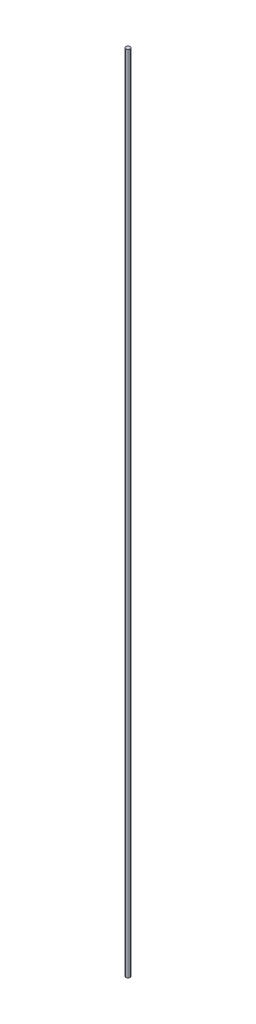
ISO-10303-21;
HEADER;
FILE_DESCRIPTION(('STEP AP214'),'2;1');
FILE_NAME('part.step','',(''),(''),'','','');
FILE_SCHEMA(('AUTOMOTIVE_DESIGN { 1 0 10303 214 1 1 1 1 }'));
ENDSEC;
DATA;
#1=APPLICATION_CONTEXT('core data for automotive mechanical design processes');
#2=APPLICATION_PROTOCOL_DEFINITION('international standard','automotive_design',2000,#1);
#3=PRODUCT_CONTEXT('',#1,'mechanical');
#4=PRODUCT('Part','Part','',(#3));
#5=PRODUCT_RELATED_PRODUCT_CATEGORY('part','',(#4));
#6=PRODUCT_DEFINITION_FORMATION('','',#4);
#7=PRODUCT_DEFINITION_CONTEXT('part definition',#1,'design');
#8=PRODUCT_DEFINITION('design','',#6,#7);
#9=PRODUCT_DEFINITION_SHAPE('','',#8);
#10=(LENGTH_UNIT() NAMED_UNIT(*) SI_UNIT(.MILLI.,.METRE.));
#11=(NAMED_UNIT(*) PLANE_ANGLE_UNIT() SI_UNIT($,.RADIAN.));
#12=(NAMED_UNIT(*) SI_UNIT($,.STERADIAN.) SOLID_ANGLE_UNIT());
#13=UNCERTAINTY_MEASURE_WITH_UNIT(LENGTH_MEASURE(1.E-05),#10,'distance_accuracy_value','');
#14=(GEOMETRIC_REPRESENTATION_CONTEXT(3) GLOBAL_UNCERTAINTY_ASSIGNED_CONTEXT((#13)) GLOBAL_UNIT_ASSIGNED_CONTEXT((#10,
#11,#12)) REPRESENTATION_CONTEXT('',''));
#15=CARTESIAN_POINT('',(0.,0.,0.));
#16=DIRECTION('',(0.,0.,1.));
#17=DIRECTION('',(1.,0.,0.));
#18=AXIS2_PLACEMENT_3D('',#15,#16,#17);
#19=CARTESIAN_POINT('',(0.,0.,0.));
#20=DIRECTION('',(0.,1.,0.));
#21=DIRECTION('',(0.,0.,1.));
#22=AXIS2_PLACEMENT_3D('',#19,#20,#21);
#23=PLANE('',#22);
#24=CARTESIAN_POINT('',(0.,0.,0.));
#25=DIRECTION('',(0.,1.,0.));
#26=DIRECTION('',(0.,0.,1.));
#27=AXIS2_PLACEMENT_3D('',#24,#25,#26);
#28=CIRCLE('',#27,6.35);
#29=CARTESIAN_POINT('',(0.,0.,6.35));
#30=VERTEX_POINT('',#29);
#31=EDGE_CURVE('E48',#30,#30,#28,.T.);
#32=ORIENTED_EDGE('',*,*,#31,.F.);
#33=EDGE_LOOP('',(#32));
#34=FACE_BOUND('',#33,.T.);
#35=ADVANCED_FACE('F42',(#34),#23,.F.);
#36=CARTESIAN_POINT('',(0.,2457.196,0.));
#37=DIRECTION('',(0.,1.,0.));
#38=DIRECTION('',(0.,0.,1.));
#39=AXIS2_PLACEMENT_3D('',#36,#37,#38);
#40=PLANE('',#39);
#41=CARTESIAN_POINT('',(0.,2457.196,0.));
#42=DIRECTION('',(0.,1.,0.));
#43=DIRECTION('',(0.,0.,1.));
#44=AXIS2_PLACEMENT_3D('',#41,#42,#43);
#45=CIRCLE('',#44,6.35);
#46=CARTESIAN_POINT('',(0.,2457.196,6.35));
#47=VERTEX_POINT('',#46);
#48=EDGE_CURVE('E11',#47,#47,#45,.T.);
#49=ORIENTED_EDGE('',*,*,#48,.T.);
#50=EDGE_LOOP('',(#49));
#51=FACE_BOUND('',#50,.T.);
#52=ADVANCED_FACE('F57',(#51),#40,.T.);
#53=CARTESIAN_POINT('',(0.,0.,0.));
#54=DIRECTION('',(0.,1.,0.));
#55=DIRECTION('',(0.,0.,1.));
#56=AXIS2_PLACEMENT_3D('',#53,#54,#55);
#57=CYLINDRICAL_SURFACE('',#56,6.35);
#58=ORIENTED_EDGE('',*,*,#48,.F.);
#59=EDGE_LOOP('',(#58));
#60=FACE_BOUND('',#59,.T.);
#61=ORIENTED_EDGE('',*,*,#31,.T.);
#62=EDGE_LOOP('',(#61));
#63=FACE_BOUND('',#62,.T.);
#64=ADVANCED_FACE('F54',(#60,#63),#57,.T.);
#65=CLOSED_SHELL('',(#35,#52,#64));
#66=MANIFOLD_SOLID_BREP('B2',#65);
#67=ADVANCED_BREP_SHAPE_REPRESENTATION('',(#18,#66),#14);
#68=SHAPE_DEFINITION_REPRESENTATION(#9,#67);
ENDSEC;
END-ISO-10303-21;
